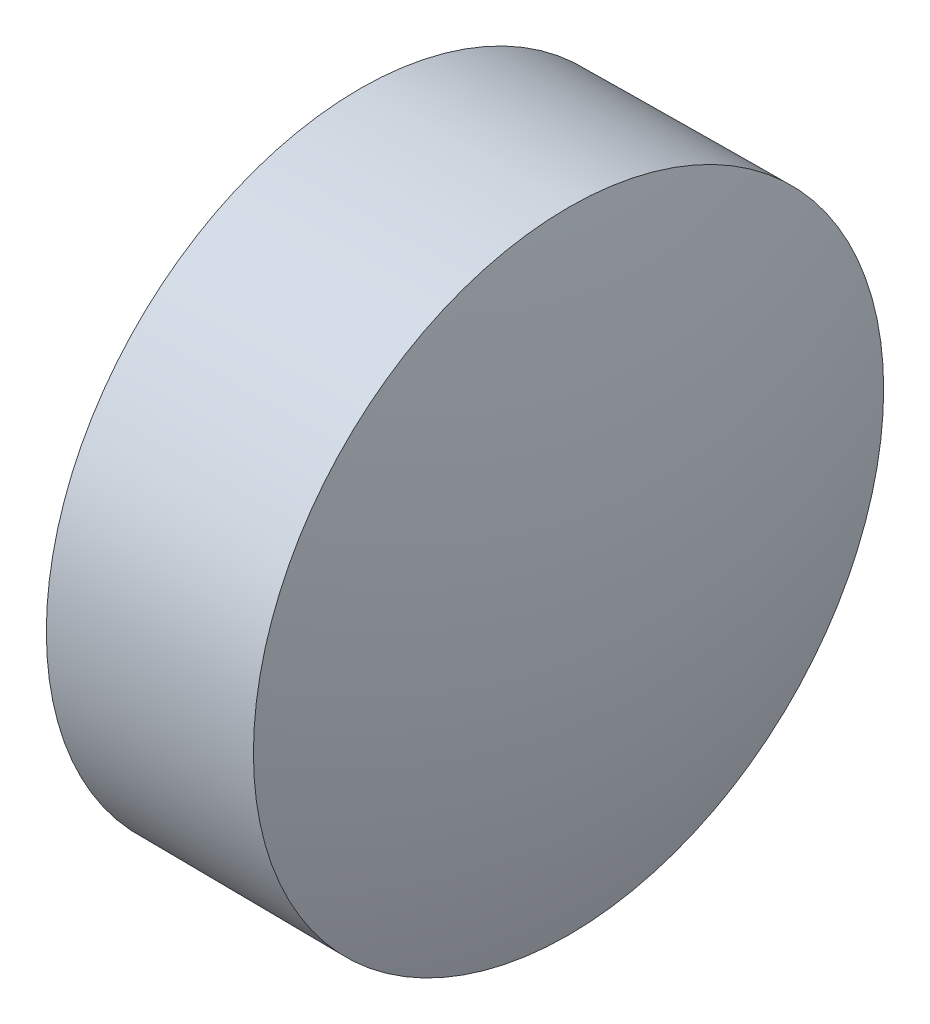
ISO-10303-21;
HEADER;
FILE_DESCRIPTION(('STEP AP214'),'2;1');
FILE_NAME('part.step','',(''),(''),'','','');
FILE_SCHEMA(('AUTOMOTIVE_DESIGN { 1 0 10303 214 1 1 1 1 }'));
ENDSEC;
DATA;
#1=APPLICATION_CONTEXT('core data for automotive mechanical design processes');
#2=APPLICATION_PROTOCOL_DEFINITION('international standard','automotive_design',2000,#1);
#3=PRODUCT_CONTEXT('',#1,'mechanical');
#4=PRODUCT('Part','Part','',(#3));
#5=PRODUCT_RELATED_PRODUCT_CATEGORY('part','',(#4));
#6=PRODUCT_DEFINITION_FORMATION('','',#4);
#7=PRODUCT_DEFINITION_CONTEXT('part definition',#1,'design');
#8=PRODUCT_DEFINITION('design','',#6,#7);
#9=PRODUCT_DEFINITION_SHAPE('','',#8);
#10=(LENGTH_UNIT() NAMED_UNIT(*) SI_UNIT(.MILLI.,.METRE.));
#11=(NAMED_UNIT(*) PLANE_ANGLE_UNIT() SI_UNIT($,.RADIAN.));
#12=(NAMED_UNIT(*) SI_UNIT($,.STERADIAN.) SOLID_ANGLE_UNIT());
#13=UNCERTAINTY_MEASURE_WITH_UNIT(LENGTH_MEASURE(1.E-05),#10,'distance_accuracy_value','');
#14=(GEOMETRIC_REPRESENTATION_CONTEXT(3) GLOBAL_UNCERTAINTY_ASSIGNED_CONTEXT((#13)) GLOBAL_UNIT_ASSIGNED_CONTEXT((#10,
#11,#12)) REPRESENTATION_CONTEXT('',''));
#15=CARTESIAN_POINT('',(0.,0.,0.));
#16=DIRECTION('',(0.,0.,1.));
#17=DIRECTION('',(1.,0.,0.));
#18=AXIS2_PLACEMENT_3D('',#15,#16,#17);
#19=CARTESIAN_POINT('',(22.6995244489052,0.,0.));
#20=DIRECTION('',(-1.,0.,0.));
#21=DIRECTION('',(0.,1.,0.));
#22=AXIS2_PLACEMENT_3D('',#19,#20,#21);
#23=SPHERICAL_SURFACE('',#22,22.6995244489052);
#24=CARTESIAN_POINT('',(0.00551006641670918,0.,0.));
#25=DIRECTION('',(-1.,0.,0.));
#26=DIRECTION('',(0.,0.,1.));
#27=AXIS2_PLACEMENT_3D('',#24,#25,#26);
#28=CIRCLE('',#27,0.500121399112651);
#29=CARTESIAN_POINT('',(0.00551006641670918,0.,0.500121399112651));
#30=VERTEX_POINT('',#29);
#31=EDGE_CURVE('E48',#30,#30,#28,.T.);
#32=ORIENTED_EDGE('',*,*,#31,.T.);
#33=EDGE_LOOP('',(#32));
#34=FACE_BOUND('',#33,.T.);
#35=ADVANCED_FACE('F42',(#34),#23,.T.);
#36=CARTESIAN_POINT('',(-1.30777419904149,0.,0.));
#37=DIRECTION('',(-1.,0.,0.));
#38=DIRECTION('',(0.,1.,0.));
#39=AXIS2_PLACEMENT_3D('',#36,#37,#38);
#40=SPHERICAL_SURFACE('',#39,1.72109908874507);
#41=CARTESIAN_POINT('',(0.338301846033877,0.,0.));
#42=DIRECTION('',(-1.,0.,0.));
#43=DIRECTION('',(0.,0.,1.));
#44=AXIS2_PLACEMENT_3D('',#41,#42,#43);
#45=CIRCLE('',#44,0.502608920641241);
#46=CARTESIAN_POINT('',(0.338301846033877,0.,0.502608920641241));
#47=VERTEX_POINT('',#46);
#48=EDGE_CURVE('E12',#47,#47,#45,.T.);
#49=ORIENTED_EDGE('',*,*,#48,.F.);
#50=EDGE_LOOP('',(#49));
#51=FACE_BOUND('',#50,.T.);
#52=ADVANCED_FACE('F57',(#51),#40,.T.);
#53=CARTESIAN_POINT('',(0.338301846033877,0.,0.));
#54=DIRECTION('',(1.,0.,0.));
#55=DIRECTION('',(0.,0.,-1.));
#56=AXIS2_PLACEMENT_3D('',#53,#54,#55);
#57=CONICAL_SURFACE('',#56,0.502608920641241,0.00747456925171526);
#58=ORIENTED_EDGE('',*,*,#31,.F.);
#59=EDGE_LOOP('',(#58));
#60=FACE_BOUND('',#59,.T.);
#61=ORIENTED_EDGE('',*,*,#48,.T.);
#62=EDGE_LOOP('',(#61));
#63=FACE_BOUND('',#62,.T.);
#64=ADVANCED_FACE('F55',(#60,#63),#57,.T.);
#65=CLOSED_SHELL('',(#35,#52,#64));
#66=MANIFOLD_SOLID_BREP('B2',#65);
#67=ADVANCED_BREP_SHAPE_REPRESENTATION('',(#18,#66),#14);
#68=SHAPE_DEFINITION_REPRESENTATION(#9,#67);
ENDSEC;
END-ISO-10303-21;
